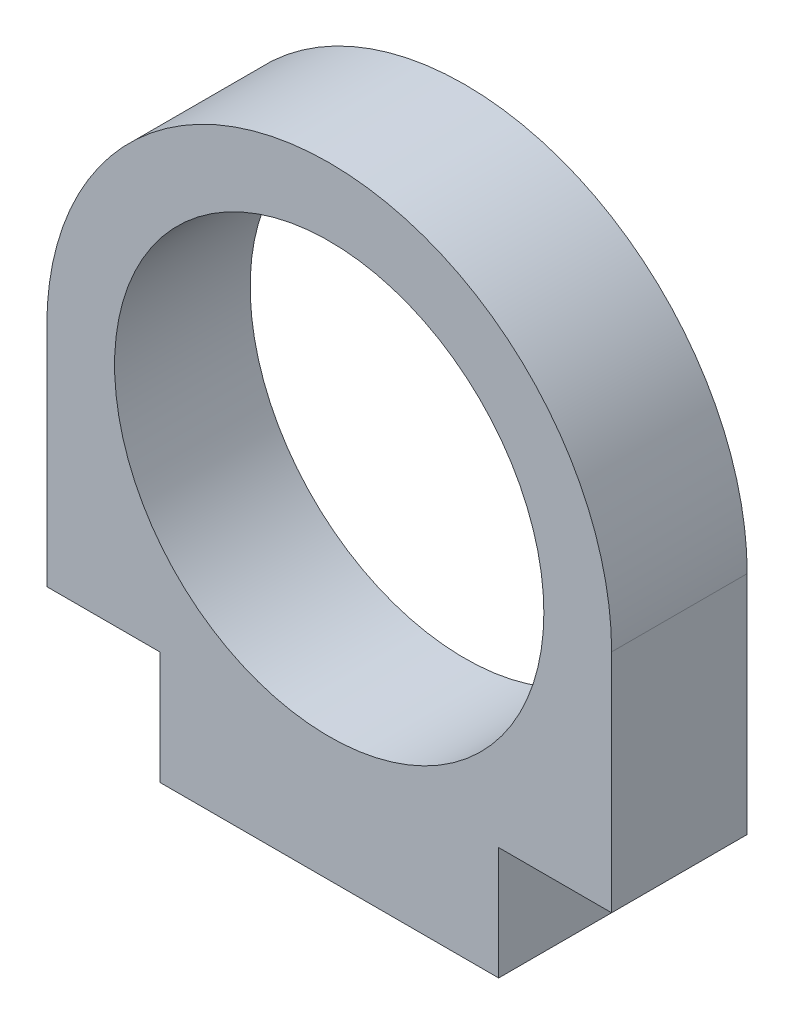
ISO-10303-21;
HEADER;
FILE_DESCRIPTION(('STEP AP214'),'2;1');
FILE_NAME('part.step','',(''),(''),'','','');
FILE_SCHEMA(('AUTOMOTIVE_DESIGN { 1 0 10303 214 1 1 1 1 }'));
ENDSEC;
DATA;
#1=APPLICATION_CONTEXT('core data for automotive mechanical design processes');
#2=APPLICATION_PROTOCOL_DEFINITION('international standard','automotive_design',2000,#1);
#3=PRODUCT_CONTEXT('',#1,'mechanical');
#4=PRODUCT('Part','Part','',(#3));
#5=PRODUCT_RELATED_PRODUCT_CATEGORY('part','',(#4));
#6=PRODUCT_DEFINITION_FORMATION('','',#4);
#7=PRODUCT_DEFINITION_CONTEXT('part definition',#1,'design');
#8=PRODUCT_DEFINITION('design','',#6,#7);
#9=PRODUCT_DEFINITION_SHAPE('','',#8);
#10=(LENGTH_UNIT() NAMED_UNIT(*) SI_UNIT(.MILLI.,.METRE.));
#11=(NAMED_UNIT(*) PLANE_ANGLE_UNIT() SI_UNIT($,.RADIAN.));
#12=(NAMED_UNIT(*) SI_UNIT($,.STERADIAN.) SOLID_ANGLE_UNIT());
#13=UNCERTAINTY_MEASURE_WITH_UNIT(LENGTH_MEASURE(1.E-05),#10,'distance_accuracy_value','');
#14=(GEOMETRIC_REPRESENTATION_CONTEXT(3) GLOBAL_UNCERTAINTY_ASSIGNED_CONTEXT((#13)) GLOBAL_UNIT_ASSIGNED_CONTEXT((#10,
#11,#12)) REPRESENTATION_CONTEXT('',''));
#15=CARTESIAN_POINT('',(0.,0.,0.));
#16=DIRECTION('',(0.,0.,1.));
#17=DIRECTION('',(1.,0.,0.));
#18=AXIS2_PLACEMENT_3D('',#15,#16,#17);
#19=CARTESIAN_POINT('',(0.,-10.,6.));
#20=DIRECTION('',(0.,1.,0.));
#21=DIRECTION('',(0.,0.,1.));
#22=AXIS2_PLACEMENT_3D('',#19,#20,#21);
#23=PLANE('',#22);
#24=DIRECTION('',(1.,0.,0.));
#25=VECTOR('',#24,1.);
#26=CARTESIAN_POINT('',(0.,-10.,0.));
#27=LINE('',#26,#25);
#28=CARTESIAN_POINT('',(-12.5,-10.,0.));
#29=VERTEX_POINT('',#28);
#30=CARTESIAN_POINT('',(-7.5,-10.,0.));
#31=VERTEX_POINT('',#30);
#32=EDGE_CURVE('E139',#29,#31,#27,.T.);
#33=ORIENTED_EDGE('',*,*,#32,.T.);
#34=DIRECTION('',(0.,0.,-1.));
#35=VECTOR('',#34,1.);
#36=CARTESIAN_POINT('',(-7.5,-10.,6.));
#37=LINE('',#36,#35);
#38=CARTESIAN_POINT('',(-7.5,-10.,6.));
#39=VERTEX_POINT('',#38);
#40=EDGE_CURVE('E11',#39,#31,#37,.T.);
#41=ORIENTED_EDGE('',*,*,#40,.F.);
#42=DIRECTION('',(1.,0.,0.));
#43=VECTOR('',#42,1.);
#44=CARTESIAN_POINT('',(0.,-10.,6.));
#45=LINE('',#44,#43);
#46=CARTESIAN_POINT('',(-12.5,-10.,6.));
#47=VERTEX_POINT('',#46);
#48=EDGE_CURVE('E130',#47,#39,#45,.T.);
#49=ORIENTED_EDGE('',*,*,#48,.F.);
#50=DIRECTION('',(0.,0.,-1.));
#51=VECTOR('',#50,1.);
#52=CARTESIAN_POINT('',(-12.5,-10.,6.));
#53=LINE('',#52,#51);
#54=EDGE_CURVE('E135',#47,#29,#53,.T.);
#55=ORIENTED_EDGE('',*,*,#54,.T.);
#56=EDGE_LOOP('',(#33,#41,#49,#55));
#57=FACE_BOUND('',#56,.T.);
#58=ADVANCED_FACE('F35',(#57),#23,.F.);
#59=CARTESIAN_POINT('',(-7.5,0.,6.));
#60=DIRECTION('',(1.,0.,0.));
#61=DIRECTION('',(0.,1.,0.));
#62=AXIS2_PLACEMENT_3D('',#59,#60,#61);
#63=PLANE('',#62);
#64=DIRECTION('',(0.,-1.,0.));
#65=VECTOR('',#64,1.);
#66=CARTESIAN_POINT('',(-7.5,0.,0.));
#67=LINE('',#66,#65);
#68=CARTESIAN_POINT('',(-7.5,-15.,0.));
#69=VERTEX_POINT('',#68);
#70=EDGE_CURVE('E142',#31,#69,#67,.T.);
#71=ORIENTED_EDGE('',*,*,#70,.T.);
#72=DIRECTION('',(0.,0.,-1.));
#73=VECTOR('',#72,1.);
#74=CARTESIAN_POINT('',(-7.5,-15.,6.));
#75=LINE('',#74,#73);
#76=CARTESIAN_POINT('',(-7.5,-15.,6.));
#77=VERTEX_POINT('',#76);
#78=EDGE_CURVE('E44',#77,#69,#75,.T.);
#79=ORIENTED_EDGE('',*,*,#78,.F.);
#80=DIRECTION('',(0.,-1.,0.));
#81=VECTOR('',#80,1.);
#82=CARTESIAN_POINT('',(-7.5,0.,6.));
#83=LINE('',#82,#81);
#84=EDGE_CURVE('E94',#39,#77,#83,.T.);
#85=ORIENTED_EDGE('',*,*,#84,.F.);
#86=ORIENTED_EDGE('',*,*,#40,.T.);
#87=EDGE_LOOP('',(#71,#79,#85,#86));
#88=FACE_BOUND('',#87,.T.);
#89=ADVANCED_FACE('F195',(#88),#63,.F.);
#90=CARTESIAN_POINT('',(0.,-15.,6.));
#91=DIRECTION('',(0.,1.,0.));
#92=DIRECTION('',(0.,0.,1.));
#93=AXIS2_PLACEMENT_3D('',#90,#91,#92);
#94=PLANE('',#93);
#95=DIRECTION('',(1.,0.,0.));
#96=VECTOR('',#95,1.);
#97=CARTESIAN_POINT('',(0.,-15.,0.));
#98=LINE('',#97,#96);
#99=CARTESIAN_POINT('',(7.5,-15.,0.));
#100=VERTEX_POINT('',#99);
#101=EDGE_CURVE('E145',#69,#100,#98,.T.);
#102=ORIENTED_EDGE('',*,*,#101,.T.);
#103=DIRECTION('',(0.,0.,-1.));
#104=VECTOR('',#103,1.);
#105=CARTESIAN_POINT('',(7.5,-15.,6.));
#106=LINE('',#105,#104);
#107=CARTESIAN_POINT('',(7.5,-15.,6.));
#108=VERTEX_POINT('',#107);
#109=EDGE_CURVE('E160',#108,#100,#106,.T.);
#110=ORIENTED_EDGE('',*,*,#109,.F.);
#111=DIRECTION('',(1.,0.,0.));
#112=VECTOR('',#111,1.);
#113=CARTESIAN_POINT('',(0.,-15.,6.));
#114=LINE('',#113,#112);
#115=EDGE_CURVE('E167',#77,#108,#114,.T.);
#116=ORIENTED_EDGE('',*,*,#115,.F.);
#117=ORIENTED_EDGE('',*,*,#78,.T.);
#118=EDGE_LOOP('',(#102,#110,#116,#117));
#119=FACE_BOUND('',#118,.T.);
#120=ADVANCED_FACE('F165',(#119),#94,.F.);
#121=CARTESIAN_POINT('',(7.5,0.,6.));
#122=DIRECTION('',(1.,0.,0.));
#123=DIRECTION('',(0.,0.,-1.));
#124=AXIS2_PLACEMENT_3D('',#121,#122,#123);
#125=PLANE('',#124);
#126=DIRECTION('',(0.,-1.,0.));
#127=VECTOR('',#126,1.);
#128=CARTESIAN_POINT('',(7.5,0.,0.));
#129=LINE('',#128,#127);
#130=CARTESIAN_POINT('',(7.5,-10.,0.));
#131=VERTEX_POINT('',#130);
#132=EDGE_CURVE('E148',#131,#100,#129,.T.);
#133=ORIENTED_EDGE('',*,*,#132,.F.);
#134=DIRECTION('',(0.,0.,-1.));
#135=VECTOR('',#134,1.);
#136=CARTESIAN_POINT('',(7.5,-10.,6.));
#137=LINE('',#136,#135);
#138=CARTESIAN_POINT('',(7.5,-10.,6.));
#139=VERTEX_POINT('',#138);
#140=EDGE_CURVE('E158',#139,#131,#137,.T.);
#141=ORIENTED_EDGE('',*,*,#140,.F.);
#142=DIRECTION('',(0.,-1.,0.));
#143=VECTOR('',#142,1.);
#144=CARTESIAN_POINT('',(7.5,0.,6.));
#145=LINE('',#144,#143);
#146=EDGE_CURVE('E128',#139,#108,#145,.T.);
#147=ORIENTED_EDGE('',*,*,#146,.T.);
#148=ORIENTED_EDGE('',*,*,#109,.T.);
#149=EDGE_LOOP('',(#133,#141,#147,#148));
#150=FACE_BOUND('',#149,.T.);
#151=ADVANCED_FACE('F175',(#150),#125,.T.);
#152=CARTESIAN_POINT('',(12.5,-10.,0.));
#153=VERTEX_POINT('',#152);
#154=EDGE_CURVE('E143',#131,#153,#27,.T.);
#155=ORIENTED_EDGE('',*,*,#154,.T.);
#156=DIRECTION('',(0.,0.,-1.));
#157=VECTOR('',#156,1.);
#158=CARTESIAN_POINT('',(12.5,-10.,6.));
#159=LINE('',#158,#157);
#160=CARTESIAN_POINT('',(12.5,-10.,6.));
#161=VERTEX_POINT('',#160);
#162=EDGE_CURVE('E116',#161,#153,#159,.T.);
#163=ORIENTED_EDGE('',*,*,#162,.F.);
#164=EDGE_CURVE('E125',#139,#161,#45,.T.);
#165=ORIENTED_EDGE('',*,*,#164,.F.);
#166=ORIENTED_EDGE('',*,*,#140,.T.);
#167=EDGE_LOOP('',(#155,#163,#165,#166));
#168=FACE_BOUND('',#167,.T.);
#169=ADVANCED_FACE('F198',(#168),#23,.F.);
#170=CARTESIAN_POINT('',(12.5,0.,6.));
#171=DIRECTION('',(1.,0.,0.));
#172=DIRECTION('',(0.,1.,0.));
#173=AXIS2_PLACEMENT_3D('',#170,#171,#172);
#174=PLANE('',#173);
#175=DIRECTION('',(0.,-1.,0.));
#176=VECTOR('',#175,1.);
#177=CARTESIAN_POINT('',(12.5,0.,0.));
#178=LINE('',#177,#176);
#179=CARTESIAN_POINT('',(12.5,0.,0.));
#180=VERTEX_POINT('',#179);
#181=EDGE_CURVE('E115',#180,#153,#178,.T.);
#182=ORIENTED_EDGE('',*,*,#181,.F.);
#183=DIRECTION('',(0.,0.,-1.));
#184=VECTOR('',#183,1.);
#185=CARTESIAN_POINT('',(12.5,0.,6.));
#186=LINE('',#185,#184);
#187=CARTESIAN_POINT('',(12.5,0.,6.));
#188=VERTEX_POINT('',#187);
#189=EDGE_CURVE('E109',#188,#180,#186,.T.);
#190=ORIENTED_EDGE('',*,*,#189,.F.);
#191=DIRECTION('',(0.,-1.,0.));
#192=VECTOR('',#191,1.);
#193=CARTESIAN_POINT('',(12.5,0.,6.));
#194=LINE('',#193,#192);
#195=EDGE_CURVE('E113',#188,#161,#194,.T.);
#196=ORIENTED_EDGE('',*,*,#195,.T.);
#197=ORIENTED_EDGE('',*,*,#162,.T.);
#198=EDGE_LOOP('',(#182,#190,#196,#197));
#199=FACE_BOUND('',#198,.T.);
#200=ADVANCED_FACE('F111',(#199),#174,.T.);
#201=CARTESIAN_POINT('',(0.,0.,6.));
#202=DIRECTION('',(0.,0.,-1.));
#203=DIRECTION('',(-1.,0.,0.));
#204=AXIS2_PLACEMENT_3D('',#201,#202,#203);
#205=CYLINDRICAL_SURFACE('',#204,12.5);
#206=CARTESIAN_POINT('',(0.,0.,0.));
#207=DIRECTION('',(0.,0.,1.));
#208=DIRECTION('',(1.,0.,0.));
#209=AXIS2_PLACEMENT_3D('',#206,#207,#208);
#210=CIRCLE('',#209,12.5);
#211=CARTESIAN_POINT('',(-12.5,0.,0.));
#212=VERTEX_POINT('',#211);
#213=EDGE_CURVE('E80',#180,#212,#210,.T.);
#214=ORIENTED_EDGE('',*,*,#213,.T.);
#215=DIRECTION('',(0.,0.,-1.));
#216=VECTOR('',#215,1.);
#217=CARTESIAN_POINT('',(-12.5,0.,6.));
#218=LINE('',#217,#216);
#219=CARTESIAN_POINT('',(-12.5,0.,6.));
#220=VERTEX_POINT('',#219);
#221=EDGE_CURVE('E117',#220,#212,#218,.T.);
#222=ORIENTED_EDGE('',*,*,#221,.F.);
#223=CARTESIAN_POINT('',(0.,0.,6.));
#224=DIRECTION('',(0.,0.,1.));
#225=DIRECTION('',(1.,0.,0.));
#226=AXIS2_PLACEMENT_3D('',#223,#224,#225);
#227=CIRCLE('',#226,12.5);
#228=EDGE_CURVE('E119',#188,#220,#227,.T.);
#229=ORIENTED_EDGE('',*,*,#228,.F.);
#230=ORIENTED_EDGE('',*,*,#189,.T.);
#231=EDGE_LOOP('',(#214,#222,#229,#230));
#232=FACE_BOUND('',#231,.T.);
#233=ADVANCED_FACE('F120',(#232),#205,.T.);
#234=CARTESIAN_POINT('',(0.,0.,6.));
#235=DIRECTION('',(0.,0.,-1.));
#236=DIRECTION('',(-1.,0.,0.));
#237=AXIS2_PLACEMENT_3D('',#234,#235,#236);
#238=CYLINDRICAL_SURFACE('',#237,9.5);
#239=CARTESIAN_POINT('',(0.,0.,6.));
#240=DIRECTION('',(0.,0.,1.));
#241=DIRECTION('',(1.,0.,0.));
#242=AXIS2_PLACEMENT_3D('',#239,#240,#241);
#243=CIRCLE('',#242,9.5);
#244=CARTESIAN_POINT('',(9.5,0.,6.));
#245=VERTEX_POINT('',#244);
#246=EDGE_CURVE('E154',#245,#245,#243,.T.);
#247=ORIENTED_EDGE('',*,*,#246,.T.);
#248=EDGE_LOOP('',(#247));
#249=FACE_BOUND('',#248,.T.);
#250=CARTESIAN_POINT('',(0.,0.,0.));
#251=DIRECTION('',(0.,0.,1.));
#252=DIRECTION('',(1.,0.,0.));
#253=AXIS2_PLACEMENT_3D('',#250,#251,#252);
#254=CIRCLE('',#253,9.5);
#255=CARTESIAN_POINT('',(9.5,0.,0.));
#256=VERTEX_POINT('',#255);
#257=EDGE_CURVE('E136',#256,#256,#254,.T.);
#258=ORIENTED_EDGE('',*,*,#257,.F.);
#259=EDGE_LOOP('',(#258));
#260=FACE_BOUND('',#259,.T.);
#261=ADVANCED_FACE('F37',(#249,#260),#238,.F.);
#262=CARTESIAN_POINT('',(-12.5,0.,6.));
#263=DIRECTION('',(1.,0.,0.));
#264=DIRECTION('',(0.,1.,0.));
#265=AXIS2_PLACEMENT_3D('',#262,#263,#264);
#266=PLANE('',#265);
#267=DIRECTION('',(0.,-1.,0.));
#268=VECTOR('',#267,1.);
#269=CARTESIAN_POINT('',(-12.5,0.,0.));
#270=LINE('',#269,#268);
#271=EDGE_CURVE('E86',#212,#29,#270,.T.);
#272=ORIENTED_EDGE('',*,*,#271,.T.);
#273=ORIENTED_EDGE('',*,*,#54,.F.);
#274=DIRECTION('',(0.,-1.,0.));
#275=VECTOR('',#274,1.);
#276=CARTESIAN_POINT('',(-12.5,0.,6.));
#277=LINE('',#276,#275);
#278=EDGE_CURVE('E52',#220,#47,#277,.T.);
#279=ORIENTED_EDGE('',*,*,#278,.F.);
#280=ORIENTED_EDGE('',*,*,#221,.T.);
#281=EDGE_LOOP('',(#272,#273,#279,#280));
#282=FACE_BOUND('',#281,.T.);
#283=ADVANCED_FACE('F185',(#282),#266,.F.);
#284=CARTESIAN_POINT('',(0.,0.,6.));
#285=DIRECTION('',(0.,0.,1.));
#286=DIRECTION('',(1.,0.,0.));
#287=AXIS2_PLACEMENT_3D('',#284,#285,#286);
#288=PLANE('',#287);
#289=ORIENTED_EDGE('',*,*,#246,.F.);
#290=EDGE_LOOP('',(#289));
#291=FACE_BOUND('',#290,.T.);
#292=ORIENTED_EDGE('',*,*,#48,.T.);
#293=ORIENTED_EDGE('',*,*,#84,.T.);
#294=ORIENTED_EDGE('',*,*,#115,.T.);
#295=ORIENTED_EDGE('',*,*,#146,.F.);
#296=ORIENTED_EDGE('',*,*,#164,.T.);
#297=ORIENTED_EDGE('',*,*,#195,.F.);
#298=ORIENTED_EDGE('',*,*,#228,.T.);
#299=ORIENTED_EDGE('',*,*,#278,.T.);
#300=EDGE_LOOP('',(#292,#293,#294,#295,#296,#297,#298,#299));
#301=FACE_BOUND('',#300,.T.);
#302=ADVANCED_FACE('F122',(#291,#301),#288,.T.);
#303=CARTESIAN_POINT('',(0.,0.,0.));
#304=DIRECTION('',(0.,0.,1.));
#305=DIRECTION('',(1.,0.,0.));
#306=AXIS2_PLACEMENT_3D('',#303,#304,#305);
#307=PLANE('',#306);
#308=ORIENTED_EDGE('',*,*,#257,.T.);
#309=EDGE_LOOP('',(#308));
#310=FACE_BOUND('',#309,.T.);
#311=ORIENTED_EDGE('',*,*,#32,.F.);
#312=ORIENTED_EDGE('',*,*,#271,.F.);
#313=ORIENTED_EDGE('',*,*,#213,.F.);
#314=ORIENTED_EDGE('',*,*,#181,.T.);
#315=ORIENTED_EDGE('',*,*,#154,.F.);
#316=ORIENTED_EDGE('',*,*,#132,.T.);
#317=ORIENTED_EDGE('',*,*,#101,.F.);
#318=ORIENTED_EDGE('',*,*,#70,.F.);
#319=EDGE_LOOP('',(#311,#312,#313,#314,#315,#316,#317,#318));
#320=FACE_BOUND('',#319,.T.);
#321=ADVANCED_FACE('F170',(#310,#320),#307,.F.);
#322=CLOSED_SHELL('',(#58,#89,#120,#151,#169,#200,#233,#261,#283,#302,#321));
#323=MANIFOLD_SOLID_BREP('B2',#322);
#324=ADVANCED_BREP_SHAPE_REPRESENTATION('',(#18,#323),#14);
#325=SHAPE_DEFINITION_REPRESENTATION(#9,#324);
ENDSEC;
END-ISO-10303-21;
